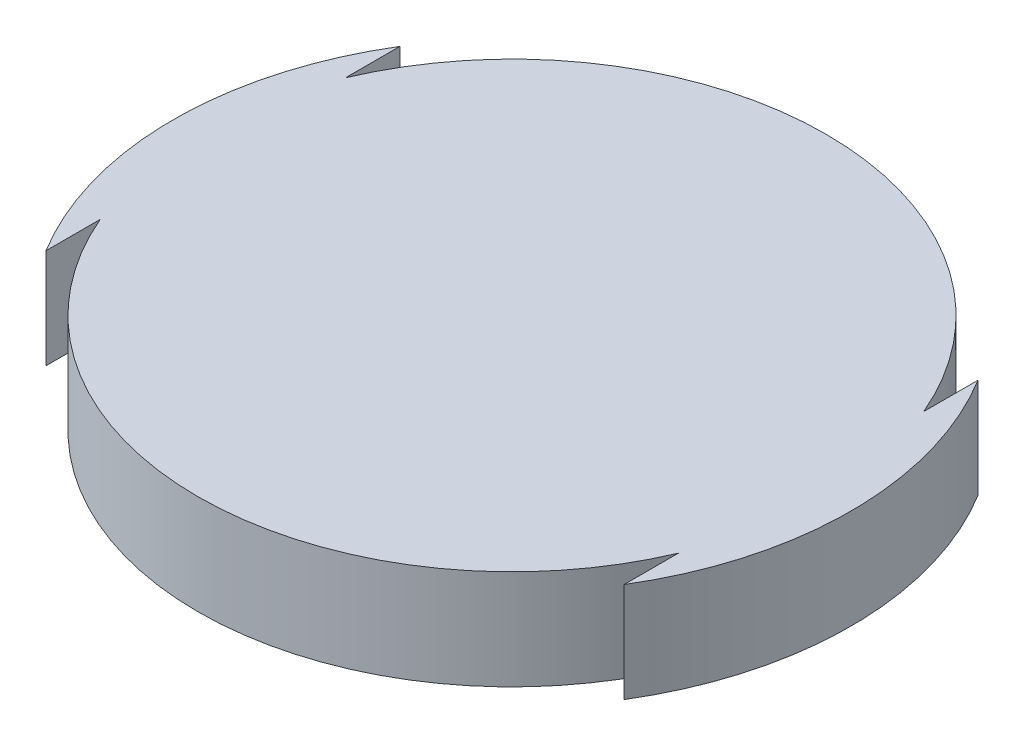
ISO-10303-21;
HEADER;
FILE_DESCRIPTION(('STEP AP214'),'2;1');
FILE_NAME('part.step','',(''),(''),'','','');
FILE_SCHEMA(('AUTOMOTIVE_DESIGN { 1 0 10303 214 1 1 1 1 }'));
ENDSEC;
DATA;
#1=APPLICATION_CONTEXT('core data for automotive mechanical design processes');
#2=APPLICATION_PROTOCOL_DEFINITION('international standard','automotive_design',2000,#1);
#3=PRODUCT_CONTEXT('',#1,'mechanical');
#4=PRODUCT('Part','Part','',(#3));
#5=PRODUCT_RELATED_PRODUCT_CATEGORY('part','',(#4));
#6=PRODUCT_DEFINITION_FORMATION('','',#4);
#7=PRODUCT_DEFINITION_CONTEXT('part definition',#1,'design');
#8=PRODUCT_DEFINITION('design','',#6,#7);
#9=PRODUCT_DEFINITION_SHAPE('','',#8);
#10=(LENGTH_UNIT() NAMED_UNIT(*) SI_UNIT(.MILLI.,.METRE.));
#11=(NAMED_UNIT(*) PLANE_ANGLE_UNIT() SI_UNIT($,.RADIAN.));
#12=(NAMED_UNIT(*) SI_UNIT($,.STERADIAN.) SOLID_ANGLE_UNIT());
#13=UNCERTAINTY_MEASURE_WITH_UNIT(LENGTH_MEASURE(1.E-05),#10,'distance_accuracy_value','');
#14=(GEOMETRIC_REPRESENTATION_CONTEXT(3) GLOBAL_UNCERTAINTY_ASSIGNED_CONTEXT((#13)) GLOBAL_UNIT_ASSIGNED_CONTEXT((#10,
#11,#12)) REPRESENTATION_CONTEXT('',''));
#15=CARTESIAN_POINT('',(0.,0.,0.));
#16=DIRECTION('',(0.,0.,1.));
#17=DIRECTION('',(1.,0.,0.));
#18=AXIS2_PLACEMENT_3D('',#15,#16,#17);
#19=CARTESIAN_POINT('',(0.,20.,0.));
#20=DIRECTION('',(0.,-1.,0.));
#21=DIRECTION('',(0.,0.,-1.));
#22=AXIS2_PLACEMENT_3D('',#19,#20,#21);
#23=CYLINDRICAL_SURFACE('',#22,68.);
#24=CARTESIAN_POINT('',(0.,20.,0.));
#25=DIRECTION('',(0.,1.,0.));
#26=DIRECTION('',(0.,0.,1.));
#27=AXIS2_PLACEMENT_3D('',#24,#25,#26);
#28=CIRCLE('',#27,68.);
#29=CARTESIAN_POINT('',(-58.,20.,-35.4964786985977));
#30=VERTEX_POINT('',#29);
#31=CARTESIAN_POINT('',(-58.,20.,35.4964786985977));
#32=VERTEX_POINT('',#31);
#33=EDGE_CURVE('E46',#30,#32,#28,.T.);
#34=ORIENTED_EDGE('',*,*,#33,.F.);
#35=DIRECTION('',(0.,1.,0.));
#36=VECTOR('',#35,1.);
#37=CARTESIAN_POINT('',(-58.,-123.854117031532,-35.4964786985977));
#38=LINE('',#37,#36);
#39=CARTESIAN_POINT('',(-58.,0.,-35.4964786985977));
#40=VERTEX_POINT('',#39);
#41=EDGE_CURVE('E130',#40,#30,#38,.T.);
#42=ORIENTED_EDGE('',*,*,#41,.F.);
#43=CARTESIAN_POINT('',(0.,0.,0.));
#44=DIRECTION('',(0.,1.,0.));
#45=DIRECTION('',(0.,0.,1.));
#46=AXIS2_PLACEMENT_3D('',#43,#44,#45);
#47=CIRCLE('',#46,68.);
#48=CARTESIAN_POINT('',(-58.,0.,35.4964786985977));
#49=VERTEX_POINT('',#48);
#50=EDGE_CURVE('E134',#40,#49,#47,.T.);
#51=ORIENTED_EDGE('',*,*,#50,.T.);
#52=DIRECTION('',(0.,1.,0.));
#53=VECTOR('',#52,1.);
#54=CARTESIAN_POINT('',(-58.,-123.854117031532,35.4964786985977));
#55=LINE('',#54,#53);
#56=EDGE_CURVE('E53',#49,#32,#55,.T.);
#57=ORIENTED_EDGE('',*,*,#56,.T.);
#58=EDGE_LOOP('',(#34,#42,#51,#57));
#59=FACE_BOUND('',#58,.T.);
#60=ADVANCED_FACE('F37',(#59),#23,.T.);
#61=CARTESIAN_POINT('',(58.,0.,35.4964786985977));
#62=VERTEX_POINT('',#61);
#63=CARTESIAN_POINT('',(58.,0.,-35.4964786985977));
#64=VERTEX_POINT('',#63);
#65=EDGE_CURVE('E41',#62,#64,#47,.T.);
#66=ORIENTED_EDGE('',*,*,#65,.T.);
#67=DIRECTION('',(0.,1.,0.));
#68=VECTOR('',#67,1.);
#69=CARTESIAN_POINT('',(58.,-123.854117031532,-35.4964786985977));
#70=LINE('',#69,#68);
#71=CARTESIAN_POINT('',(58.,20.,-35.4964786985977));
#72=VERTEX_POINT('',#71);
#73=EDGE_CURVE('E61',#64,#72,#70,.T.);
#74=ORIENTED_EDGE('',*,*,#73,.T.);
#75=CARTESIAN_POINT('',(58.,20.,35.4964786985977));
#76=VERTEX_POINT('',#75);
#77=EDGE_CURVE('E11',#76,#72,#28,.T.);
#78=ORIENTED_EDGE('',*,*,#77,.F.);
#79=DIRECTION('',(0.,1.,0.));
#80=VECTOR('',#79,1.);
#81=CARTESIAN_POINT('',(58.,-123.854117031532,35.4964786985977));
#82=LINE('',#81,#80);
#83=EDGE_CURVE('E143',#62,#76,#82,.T.);
#84=ORIENTED_EDGE('',*,*,#83,.F.);
#85=EDGE_LOOP('',(#66,#74,#78,#84));
#86=FACE_BOUND('',#85,.T.);
#87=ADVANCED_FACE('F39',(#86),#23,.T.);
#88=CARTESIAN_POINT('',(0.,20.,0.));
#89=DIRECTION('',(0.,1.,0.));
#90=DIRECTION('',(0.,0.,1.));
#91=AXIS2_PLACEMENT_3D('',#88,#89,#90);
#92=PLANE('',#91);
#93=DIRECTION('',(0.,0.,1.));
#94=VECTOR('',#93,1.);
#95=CARTESIAN_POINT('',(-58.,20.,-24.5967477524977));
#96=LINE('',#95,#94);
#97=CARTESIAN_POINT('',(-58.,20.,-24.5967477524977));
#98=VERTEX_POINT('',#97);
#99=EDGE_CURVE('E109',#30,#98,#96,.T.);
#100=ORIENTED_EDGE('',*,*,#99,.F.);
#101=ORIENTED_EDGE('',*,*,#33,.T.);
#102=DIRECTION('',(0.,0.,1.));
#103=VECTOR('',#102,1.);
#104=CARTESIAN_POINT('',(-58.,20.,35.4964786985977));
#105=LINE('',#104,#103);
#106=CARTESIAN_POINT('',(-58.,20.,24.5967477524977));
#107=VERTEX_POINT('',#106);
#108=EDGE_CURVE('E150',#107,#32,#105,.T.);
#109=ORIENTED_EDGE('',*,*,#108,.F.);
#110=CARTESIAN_POINT('',(0.,20.,0.));
#111=DIRECTION('',(0.,-1.,0.));
#112=DIRECTION('',(0.,0.,1.));
#113=AXIS2_PLACEMENT_3D('',#110,#111,#112);
#114=CIRCLE('',#113,63.);
#115=CARTESIAN_POINT('',(58.,20.,24.5967477524977));
#116=VERTEX_POINT('',#115);
#117=EDGE_CURVE('E119',#116,#107,#114,.T.);
#118=ORIENTED_EDGE('',*,*,#117,.F.);
#119=DIRECTION('',(0.,0.,-1.));
#120=VECTOR('',#119,1.);
#121=CARTESIAN_POINT('',(58.,20.,24.5967477524977));
#122=LINE('',#121,#120);
#123=EDGE_CURVE('E141',#76,#116,#122,.T.);
#124=ORIENTED_EDGE('',*,*,#123,.F.);
#125=ORIENTED_EDGE('',*,*,#77,.T.);
#126=DIRECTION('',(0.,0.,-1.));
#127=VECTOR('',#126,1.);
#128=CARTESIAN_POINT('',(58.,20.,-35.4964786985977));
#129=LINE('',#128,#127);
#130=CARTESIAN_POINT('',(58.,20.,-24.5967477524977));
#131=VERTEX_POINT('',#130);
#132=EDGE_CURVE('E105',#131,#72,#129,.T.);
#133=ORIENTED_EDGE('',*,*,#132,.F.);
#134=CARTESIAN_POINT('',(0.,20.,0.));
#135=DIRECTION('',(0.,-1.,0.));
#136=DIRECTION('',(0.,0.,1.));
#137=AXIS2_PLACEMENT_3D('',#134,#135,#136);
#138=CIRCLE('',#137,63.);
#139=EDGE_CURVE('E112',#98,#131,#138,.T.);
#140=ORIENTED_EDGE('',*,*,#139,.F.);
#141=EDGE_LOOP('',(#100,#101,#109,#118,#124,#125,#133,#140));
#142=FACE_BOUND('',#141,.T.);
#143=ADVANCED_FACE('F121',(#142),#92,.T.);
#144=CARTESIAN_POINT('',(0.,0.,0.));
#145=DIRECTION('',(0.,1.,0.));
#146=DIRECTION('',(0.,0.,1.));
#147=AXIS2_PLACEMENT_3D('',#144,#145,#146);
#148=PLANE('',#147);
#149=ORIENTED_EDGE('',*,*,#50,.F.);
#150=DIRECTION('',(0.,0.,-1.));
#151=VECTOR('',#150,1.);
#152=CARTESIAN_POINT('',(-58.,0.,-24.5967477524977));
#153=LINE('',#152,#151);
#154=CARTESIAN_POINT('',(-58.,0.,-24.5967477524977));
#155=VERTEX_POINT('',#154);
#156=EDGE_CURVE('E129',#155,#40,#153,.T.);
#157=ORIENTED_EDGE('',*,*,#156,.F.);
#158=CARTESIAN_POINT('',(0.,0.,0.));
#159=DIRECTION('',(0.,1.,0.));
#160=DIRECTION('',(0.,0.,1.));
#161=AXIS2_PLACEMENT_3D('',#158,#159,#160);
#162=CIRCLE('',#161,63.);
#163=CARTESIAN_POINT('',(58.,0.,-24.5967477524977));
#164=VERTEX_POINT('',#163);
#165=EDGE_CURVE('E135',#164,#155,#162,.T.);
#166=ORIENTED_EDGE('',*,*,#165,.F.);
#167=DIRECTION('',(0.,0.,1.));
#168=VECTOR('',#167,1.);
#169=CARTESIAN_POINT('',(58.,0.,-35.4964786985977));
#170=LINE('',#169,#168);
#171=EDGE_CURVE('E106',#64,#164,#170,.T.);
#172=ORIENTED_EDGE('',*,*,#171,.F.);
#173=ORIENTED_EDGE('',*,*,#65,.F.);
#174=DIRECTION('',(0.,0.,1.));
#175=VECTOR('',#174,1.);
#176=CARTESIAN_POINT('',(58.,0.,24.5967477524977));
#177=LINE('',#176,#175);
#178=CARTESIAN_POINT('',(58.,0.,24.5967477524977));
#179=VERTEX_POINT('',#178);
#180=EDGE_CURVE('E147',#179,#62,#177,.T.);
#181=ORIENTED_EDGE('',*,*,#180,.F.);
#182=CARTESIAN_POINT('',(0.,0.,0.));
#183=DIRECTION('',(0.,1.,0.));
#184=DIRECTION('',(0.,0.,1.));
#185=AXIS2_PLACEMENT_3D('',#182,#183,#184);
#186=CIRCLE('',#185,63.);
#187=CARTESIAN_POINT('',(-58.,0.,24.5967477524977));
#188=VERTEX_POINT('',#187);
#189=EDGE_CURVE('E138',#188,#179,#186,.T.);
#190=ORIENTED_EDGE('',*,*,#189,.F.);
#191=DIRECTION('',(0.,0.,-1.));
#192=VECTOR('',#191,1.);
#193=CARTESIAN_POINT('',(-58.,0.,35.4964786985977));
#194=LINE('',#193,#192);
#195=EDGE_CURVE('E136',#49,#188,#194,.T.);
#196=ORIENTED_EDGE('',*,*,#195,.F.);
#197=EDGE_LOOP('',(#149,#157,#166,#172,#173,#181,#190,#196));
#198=FACE_BOUND('',#197,.T.);
#199=ADVANCED_FACE('F166',(#198),#148,.F.);
#200=CARTESIAN_POINT('',(0.,-123.854117031532,0.));
#201=DIRECTION('',(0.,1.,0.));
#202=DIRECTION('',(0.,0.,1.));
#203=AXIS2_PLACEMENT_3D('',#200,#201,#202);
#204=CYLINDRICAL_SURFACE('',#203,63.);
#205=ORIENTED_EDGE('',*,*,#189,.T.);
#206=DIRECTION('',(0.,1.,0.));
#207=VECTOR('',#206,1.);
#208=CARTESIAN_POINT('',(58.,-123.854117031532,24.5967477524977));
#209=LINE('',#208,#207);
#210=EDGE_CURVE('E145',#179,#116,#209,.T.);
#211=ORIENTED_EDGE('',*,*,#210,.T.);
#212=ORIENTED_EDGE('',*,*,#117,.T.);
#213=DIRECTION('',(0.,1.,0.));
#214=VECTOR('',#213,1.);
#215=CARTESIAN_POINT('',(-58.,-123.854117031532,24.5967477524977));
#216=LINE('',#215,#214);
#217=EDGE_CURVE('E139',#188,#107,#216,.T.);
#218=ORIENTED_EDGE('',*,*,#217,.F.);
#219=EDGE_LOOP('',(#205,#211,#212,#218));
#220=FACE_BOUND('',#219,.T.);
#221=ADVANCED_FACE('F176',(#220),#204,.T.);
#222=CARTESIAN_POINT('',(58.,-123.854117031532,24.5967477524977));
#223=DIRECTION('',(1.,0.,0.));
#224=DIRECTION('',(0.,0.,-1.));
#225=AXIS2_PLACEMENT_3D('',#222,#223,#224);
#226=PLANE('',#225);
#227=ORIENTED_EDGE('',*,*,#180,.T.);
#228=ORIENTED_EDGE('',*,*,#83,.T.);
#229=ORIENTED_EDGE('',*,*,#123,.T.);
#230=ORIENTED_EDGE('',*,*,#210,.F.);
#231=EDGE_LOOP('',(#227,#228,#229,#230));
#232=FACE_BOUND('',#231,.T.);
#233=ADVANCED_FACE('F159',(#232),#226,.F.);
#234=CARTESIAN_POINT('',(-58.,-123.854117031532,35.4964786985977));
#235=DIRECTION('',(-1.,0.,0.));
#236=DIRECTION('',(0.,0.,1.));
#237=AXIS2_PLACEMENT_3D('',#234,#235,#236);
#238=PLANE('',#237);
#239=ORIENTED_EDGE('',*,*,#195,.T.);
#240=ORIENTED_EDGE('',*,*,#217,.T.);
#241=ORIENTED_EDGE('',*,*,#108,.T.);
#242=ORIENTED_EDGE('',*,*,#56,.F.);
#243=EDGE_LOOP('',(#239,#240,#241,#242));
#244=FACE_BOUND('',#243,.T.);
#245=ADVANCED_FACE('F174',(#244),#238,.F.);
#246=CARTESIAN_POINT('',(0.,-123.854117031532,0.));
#247=DIRECTION('',(0.,1.,0.));
#248=DIRECTION('',(0.,0.,1.));
#249=AXIS2_PLACEMENT_3D('',#246,#247,#248);
#250=CYLINDRICAL_SURFACE('',#249,63.);
#251=ORIENTED_EDGE('',*,*,#165,.T.);
#252=DIRECTION('',(0.,1.,0.));
#253=VECTOR('',#252,1.);
#254=CARTESIAN_POINT('',(-58.,-123.854117031532,-24.5967477524977));
#255=LINE('',#254,#253);
#256=EDGE_CURVE('E115',#155,#98,#255,.T.);
#257=ORIENTED_EDGE('',*,*,#256,.T.);
#258=ORIENTED_EDGE('',*,*,#139,.T.);
#259=DIRECTION('',(0.,1.,0.));
#260=VECTOR('',#259,1.);
#261=CARTESIAN_POINT('',(58.,-123.854117031532,-24.5967477524977));
#262=LINE('',#261,#260);
#263=EDGE_CURVE('E101',#164,#131,#262,.T.);
#264=ORIENTED_EDGE('',*,*,#263,.F.);
#265=EDGE_LOOP('',(#251,#257,#258,#264));
#266=FACE_BOUND('',#265,.T.);
#267=ADVANCED_FACE('F113',(#266),#250,.T.);
#268=CARTESIAN_POINT('',(-58.,-123.854117031532,-24.5967477524977));
#269=DIRECTION('',(-1.,0.,0.));
#270=DIRECTION('',(0.,0.,1.));
#271=AXIS2_PLACEMENT_3D('',#268,#269,#270);
#272=PLANE('',#271);
#273=ORIENTED_EDGE('',*,*,#156,.T.);
#274=ORIENTED_EDGE('',*,*,#41,.T.);
#275=ORIENTED_EDGE('',*,*,#99,.T.);
#276=ORIENTED_EDGE('',*,*,#256,.F.);
#277=EDGE_LOOP('',(#273,#274,#275,#276));
#278=FACE_BOUND('',#277,.T.);
#279=ADVANCED_FACE('F180',(#278),#272,.F.);
#280=CARTESIAN_POINT('',(58.,-123.854117031532,-35.4964786985977));
#281=DIRECTION('',(1.,0.,0.));
#282=DIRECTION('',(0.,0.,-1.));
#283=AXIS2_PLACEMENT_3D('',#280,#281,#282);
#284=PLANE('',#283);
#285=ORIENTED_EDGE('',*,*,#171,.T.);
#286=ORIENTED_EDGE('',*,*,#263,.T.);
#287=ORIENTED_EDGE('',*,*,#132,.T.);
#288=ORIENTED_EDGE('',*,*,#73,.F.);
#289=EDGE_LOOP('',(#285,#286,#287,#288));
#290=FACE_BOUND('',#289,.T.);
#291=ADVANCED_FACE('F103',(#290),#284,.F.);
#292=CLOSED_SHELL('',(#60,#87,#143,#199,#221,#233,#245,#267,#279,#291));
#293=MANIFOLD_SOLID_BREP('B2',#292);
#294=ADVANCED_BREP_SHAPE_REPRESENTATION('',(#18,#293),#14);
#295=SHAPE_DEFINITION_REPRESENTATION(#9,#294);
ENDSEC;
END-ISO-10303-21;
